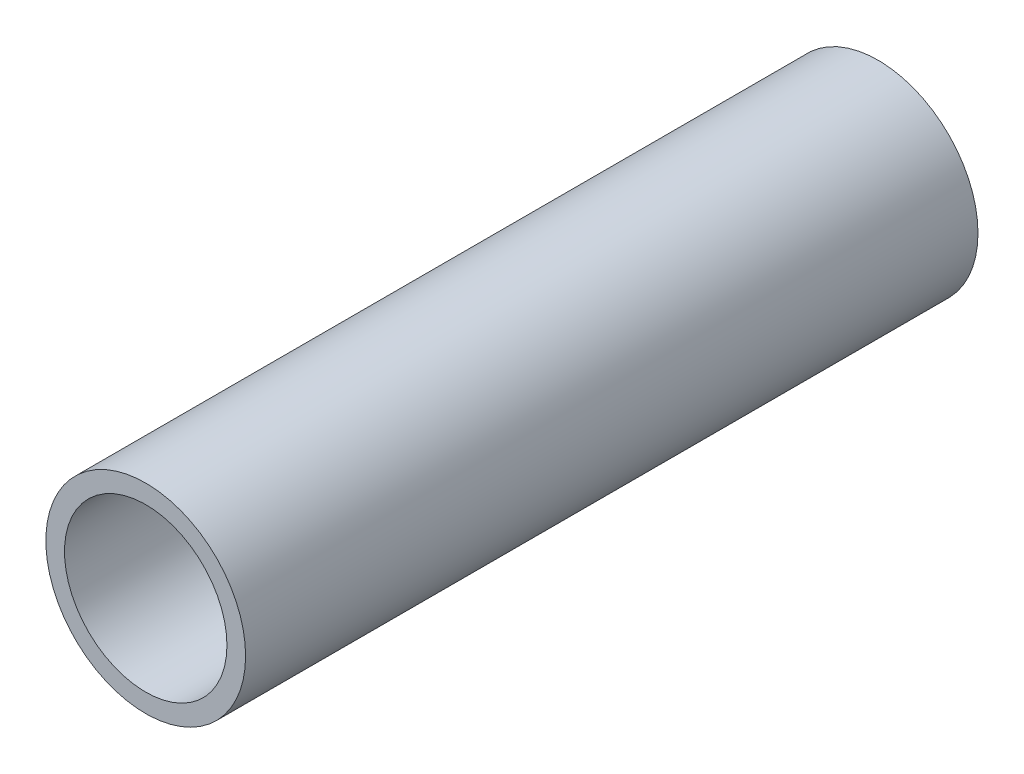
ISO-10303-21;
HEADER;
FILE_DESCRIPTION(('STEP AP214'),'2;1');
FILE_NAME('part.step','',(''),(''),'','','');
FILE_SCHEMA(('AUTOMOTIVE_DESIGN { 1 0 10303 214 1 1 1 1 }'));
ENDSEC;
DATA;
#1=APPLICATION_CONTEXT('core data for automotive mechanical design processes');
#2=APPLICATION_PROTOCOL_DEFINITION('international standard','automotive_design',2000,#1);
#3=PRODUCT_CONTEXT('',#1,'mechanical');
#4=PRODUCT('Part','Part','',(#3));
#5=PRODUCT_RELATED_PRODUCT_CATEGORY('part','',(#4));
#6=PRODUCT_DEFINITION_FORMATION('','',#4);
#7=PRODUCT_DEFINITION_CONTEXT('part definition',#1,'design');
#8=PRODUCT_DEFINITION('design','',#6,#7);
#9=PRODUCT_DEFINITION_SHAPE('','',#8);
#10=(LENGTH_UNIT() NAMED_UNIT(*) SI_UNIT(.MILLI.,.METRE.));
#11=(NAMED_UNIT(*) PLANE_ANGLE_UNIT() SI_UNIT($,.RADIAN.));
#12=(NAMED_UNIT(*) SI_UNIT($,.STERADIAN.) SOLID_ANGLE_UNIT());
#13=UNCERTAINTY_MEASURE_WITH_UNIT(LENGTH_MEASURE(1.E-05),#10,'distance_accuracy_value','');
#14=(GEOMETRIC_REPRESENTATION_CONTEXT(3) GLOBAL_UNCERTAINTY_ASSIGNED_CONTEXT((#13)) GLOBAL_UNIT_ASSIGNED_CONTEXT((#10,
#11,#12)) REPRESENTATION_CONTEXT('',''));
#15=CARTESIAN_POINT('',(0.,0.,0.));
#16=DIRECTION('',(0.,0.,1.));
#17=DIRECTION('',(1.,0.,0.));
#18=AXIS2_PLACEMENT_3D('',#15,#16,#17);
#19=CARTESIAN_POINT('',(0.,0.,0.));
#20=DIRECTION('',(0.,0.,1.));
#21=DIRECTION('',(1.,0.,0.));
#22=AXIS2_PLACEMENT_3D('',#19,#20,#21);
#23=CYLINDRICAL_SURFACE('',#22,7.5);
#24=CARTESIAN_POINT('',(0.,0.,0.));
#25=DIRECTION('',(0.,0.,1.));
#26=DIRECTION('',(1.,0.,0.));
#27=AXIS2_PLACEMENT_3D('',#24,#25,#26);
#28=CIRCLE('',#27,7.5);
#29=CARTESIAN_POINT('',(7.5,0.,0.));
#30=VERTEX_POINT('',#29);
#31=EDGE_CURVE('E10',#30,#30,#28,.T.);
#32=ORIENTED_EDGE('',*,*,#31,.T.);
#33=EDGE_LOOP('',(#32));
#34=FACE_BOUND('',#33,.T.);
#35=CARTESIAN_POINT('',(0.,0.,55.));
#36=DIRECTION('',(0.,0.,1.));
#37=DIRECTION('',(1.,0.,0.));
#38=AXIS2_PLACEMENT_3D('',#35,#36,#37);
#39=CIRCLE('',#38,7.5);
#40=CARTESIAN_POINT('',(7.5,0.,55.));
#41=VERTEX_POINT('',#40);
#42=EDGE_CURVE('E47',#41,#41,#39,.T.);
#43=ORIENTED_EDGE('',*,*,#42,.F.);
#44=EDGE_LOOP('',(#43));
#45=FACE_BOUND('',#44,.T.);
#46=ADVANCED_FACE('F34',(#34,#45),#23,.T.);
#47=CARTESIAN_POINT('',(0.,0.,0.));
#48=DIRECTION('',(0.,0.,1.));
#49=DIRECTION('',(1.,0.,0.));
#50=AXIS2_PLACEMENT_3D('',#47,#48,#49);
#51=CYLINDRICAL_SURFACE('',#50,6.1);
#52=CARTESIAN_POINT('',(0.,0.,0.));
#53=DIRECTION('',(0.,0.,1.));
#54=DIRECTION('',(1.,0.,0.));
#55=AXIS2_PLACEMENT_3D('',#52,#53,#54);
#56=CIRCLE('',#55,6.1);
#57=CARTESIAN_POINT('',(6.1,0.,0.));
#58=VERTEX_POINT('',#57);
#59=EDGE_CURVE('E41',#58,#58,#56,.T.);
#60=ORIENTED_EDGE('',*,*,#59,.F.);
#61=EDGE_LOOP('',(#60));
#62=FACE_BOUND('',#61,.T.);
#63=CARTESIAN_POINT('',(0.,0.,55.));
#64=DIRECTION('',(0.,0.,1.));
#65=DIRECTION('',(1.,0.,0.));
#66=AXIS2_PLACEMENT_3D('',#63,#64,#65);
#67=CIRCLE('',#66,6.1);
#68=CARTESIAN_POINT('',(6.1,0.,55.));
#69=VERTEX_POINT('',#68);
#70=EDGE_CURVE('E37',#69,#69,#67,.T.);
#71=ORIENTED_EDGE('',*,*,#70,.T.);
#72=EDGE_LOOP('',(#71));
#73=FACE_BOUND('',#72,.T.);
#74=ADVANCED_FACE('F54',(#62,#73),#51,.F.);
#75=CARTESIAN_POINT('',(7.5,0.,0.));
#76=DIRECTION('',(0.,0.,-1.));
#77=DIRECTION('',(-1.,0.,0.));
#78=AXIS2_PLACEMENT_3D('',#75,#76,#77);
#79=PLANE('',#78);
#80=ORIENTED_EDGE('',*,*,#59,.T.);
#81=EDGE_LOOP('',(#80));
#82=FACE_BOUND('',#81,.T.);
#83=ORIENTED_EDGE('',*,*,#31,.F.);
#84=EDGE_LOOP('',(#83));
#85=FACE_BOUND('',#84,.T.);
#86=ADVANCED_FACE('F58',(#82,#85),#79,.T.);
#87=CARTESIAN_POINT('',(0.,0.,55.));
#88=DIRECTION('',(0.,0.,1.));
#89=DIRECTION('',(1.,0.,0.));
#90=AXIS2_PLACEMENT_3D('',#87,#88,#89);
#91=PLANE('',#90);
#92=ORIENTED_EDGE('',*,*,#70,.F.);
#93=EDGE_LOOP('',(#92));
#94=FACE_BOUND('',#93,.T.);
#95=ORIENTED_EDGE('',*,*,#42,.T.);
#96=EDGE_LOOP('',(#95));
#97=FACE_BOUND('',#96,.T.);
#98=ADVANCED_FACE('F56',(#94,#97),#91,.T.);
#99=CLOSED_SHELL('',(#46,#74,#86,#98));
#100=MANIFOLD_SOLID_BREP('B2',#99);
#101=ADVANCED_BREP_SHAPE_REPRESENTATION('',(#18,#100),#14);
#102=SHAPE_DEFINITION_REPRESENTATION(#9,#101);
ENDSEC;
END-ISO-10303-21;
